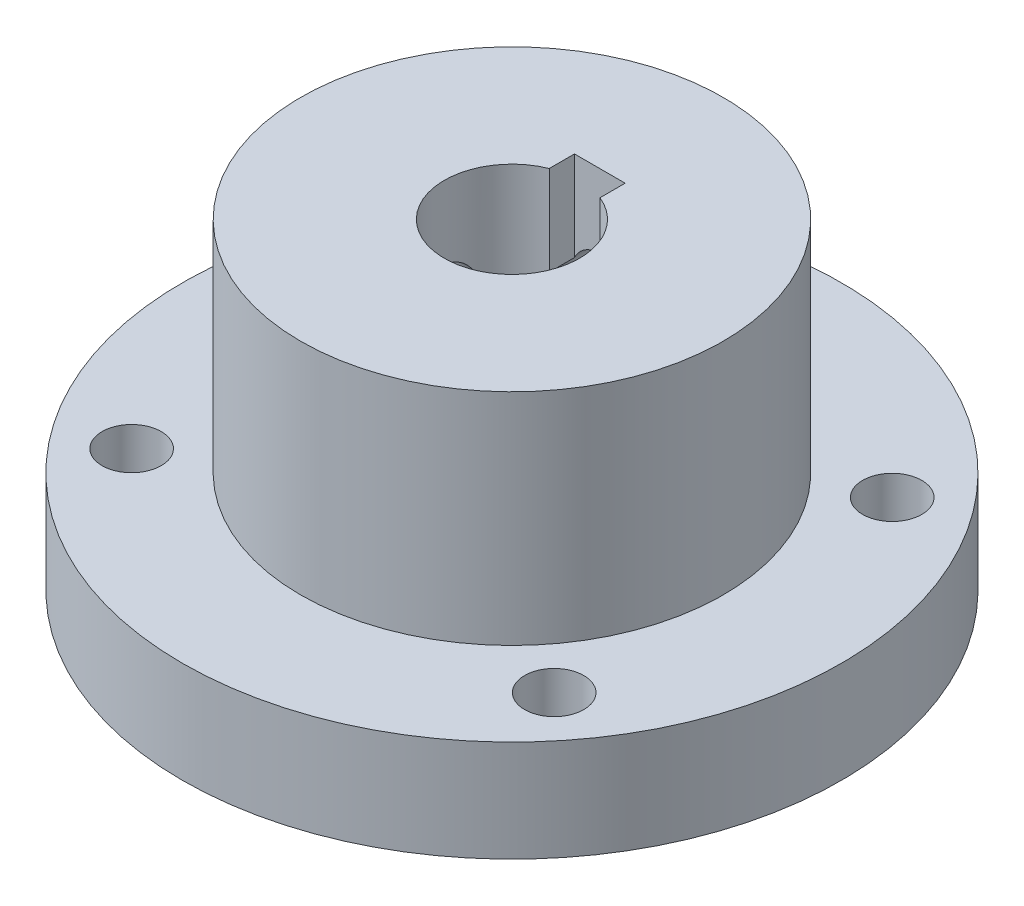
ISO-10303-21;
HEADER;
FILE_DESCRIPTION(('STEP AP214'),'2;1');
FILE_NAME('part.step','',(''),(''),'','','');
FILE_SCHEMA(('AUTOMOTIVE_DESIGN { 1 0 10303 214 1 1 1 1 }'));
ENDSEC;
DATA;
#1=APPLICATION_CONTEXT('core data for automotive mechanical design processes');
#2=APPLICATION_PROTOCOL_DEFINITION('international standard','automotive_design',2000,#1);
#3=PRODUCT_CONTEXT('',#1,'mechanical');
#4=PRODUCT('Part','Part','',(#3));
#5=PRODUCT_RELATED_PRODUCT_CATEGORY('part','',(#4));
#6=PRODUCT_DEFINITION_FORMATION('','',#4);
#7=PRODUCT_DEFINITION_CONTEXT('part definition',#1,'design');
#8=PRODUCT_DEFINITION('design','',#6,#7);
#9=PRODUCT_DEFINITION_SHAPE('','',#8);
#10=(LENGTH_UNIT() NAMED_UNIT(*) SI_UNIT(.MILLI.,.METRE.));
#11=(NAMED_UNIT(*) PLANE_ANGLE_UNIT() SI_UNIT($,.RADIAN.));
#12=(NAMED_UNIT(*) SI_UNIT($,.STERADIAN.) SOLID_ANGLE_UNIT());
#13=UNCERTAINTY_MEASURE_WITH_UNIT(LENGTH_MEASURE(1.E-05),#10,'distance_accuracy_value','');
#14=(GEOMETRIC_REPRESENTATION_CONTEXT(3) GLOBAL_UNCERTAINTY_ASSIGNED_CONTEXT((#13)) GLOBAL_UNIT_ASSIGNED_CONTEXT((#10,
#11,#12)) REPRESENTATION_CONTEXT('',''));
#15=CARTESIAN_POINT('',(0.,0.,0.));
#16=DIRECTION('',(0.,0.,1.));
#17=DIRECTION('',(1.,0.,0.));
#18=AXIS2_PLACEMENT_3D('',#15,#16,#17);
#19=CARTESIAN_POINT('',(1.5,-11.,-5.2));
#20=DIRECTION('',(1.,0.,0.));
#21=DIRECTION('',(0.,0.,-1.));
#22=AXIS2_PLACEMENT_3D('',#19,#20,#21);
#23=PLANE('',#22);
#24=DIRECTION('',(0.,-1.,0.));
#25=VECTOR('',#24,1.);
#26=CARTESIAN_POINT('',(1.5,6.,-3.70809924354783));
#27=LINE('',#26,#25);
#28=CARTESIAN_POINT('',(1.5,0.,-3.70809924354783));
#29=VERTEX_POINT('',#28);
#30=CARTESIAN_POINT('',(1.5,12.3126136457566,-3.70809924354783));
#31=VERTEX_POINT('',#30);
#32=EDGE_CURVE('E119',#29,#31,#27,.F.);
#33=ORIENTED_EDGE('',*,*,#32,.T.);
#34=DIRECTION('',(0.,0.,-1.));
#35=VECTOR('',#34,1.);
#36=CARTESIAN_POINT('',(1.5,12.3126136457566,0.499999999999997));
#37=LINE('',#36,#35);
#38=CARTESIAN_POINT('',(1.5,12.3126136457566,-5.2));
#39=VERTEX_POINT('',#38);
#40=EDGE_CURVE('E106',#31,#39,#37,.T.);
#41=ORIENTED_EDGE('',*,*,#40,.T.);
#42=DIRECTION('',(0.,1.,0.));
#43=VECTOR('',#42,1.);
#44=CARTESIAN_POINT('',(1.5,-11.,-5.2));
#45=LINE('',#44,#43);
#46=CARTESIAN_POINT('',(1.5,0.,-5.2));
#47=VERTEX_POINT('',#46);
#48=EDGE_CURVE('E116',#47,#39,#45,.T.);
#49=ORIENTED_EDGE('',*,*,#48,.F.);
#50=DIRECTION('',(0.,0.,-1.));
#51=VECTOR('',#50,1.);
#52=CARTESIAN_POINT('',(1.5,0.,0.));
#53=LINE('',#52,#51);
#54=EDGE_CURVE('E142',#29,#47,#53,.T.);
#55=ORIENTED_EDGE('',*,*,#54,.F.);
#56=EDGE_LOOP('',(#33,#41,#49,#55));
#57=FACE_BOUND('',#56,.T.);
#58=ADVANCED_FACE('F34',(#57),#23,.F.);
#59=CARTESIAN_POINT('',(-1.5,-11.,-5.2));
#60=DIRECTION('',(-1.,0.,0.));
#61=DIRECTION('',(0.,0.,1.));
#62=AXIS2_PLACEMENT_3D('',#59,#60,#61);
#63=PLANE('',#62);
#64=DIRECTION('',(0.,-1.,0.));
#65=VECTOR('',#64,1.);
#66=CARTESIAN_POINT('',(-1.5,6.,-3.70809924354783));
#67=LINE('',#66,#65);
#68=CARTESIAN_POINT('',(-1.5,19.,-3.70809924354783));
#69=VERTEX_POINT('',#68);
#70=CARTESIAN_POINT('',(-1.5,13.6873863542434,-3.70809924354783));
#71=VERTEX_POINT('',#70);
#72=EDGE_CURVE('E134',#69,#71,#67,.T.);
#73=ORIENTED_EDGE('',*,*,#72,.T.);
#74=DIRECTION('',(0.,0.,-1.));
#75=VECTOR('',#74,1.);
#76=CARTESIAN_POINT('',(-1.5,13.6873863542434,0.499999999999997));
#77=LINE('',#76,#75);
#78=CARTESIAN_POINT('',(-1.5,13.6873863542434,-5.2));
#79=VERTEX_POINT('',#78);
#80=EDGE_CURVE('E235',#71,#79,#77,.T.);
#81=ORIENTED_EDGE('',*,*,#80,.T.);
#82=DIRECTION('',(0.,1.,0.));
#83=VECTOR('',#82,1.);
#84=CARTESIAN_POINT('',(-1.5,-11.,-5.2));
#85=LINE('',#84,#83);
#86=CARTESIAN_POINT('',(-1.5,19.,-5.2));
#87=VERTEX_POINT('',#86);
#88=EDGE_CURVE('E125',#79,#87,#85,.T.);
#89=ORIENTED_EDGE('',*,*,#88,.T.);
#90=DIRECTION('',(0.,0.,1.));
#91=VECTOR('',#90,1.);
#92=CARTESIAN_POINT('',(-1.5,19.,-5.2));
#93=LINE('',#92,#91);
#94=EDGE_CURVE('E129',#87,#69,#93,.T.);
#95=ORIENTED_EDGE('',*,*,#94,.T.);
#96=EDGE_LOOP('',(#73,#81,#89,#95));
#97=FACE_BOUND('',#96,.T.);
#98=ADVANCED_FACE('F286',(#97),#63,.F.);
#99=CARTESIAN_POINT('',(-1.5,-11.,-5.2));
#100=DIRECTION('',(0.,0.,-1.));
#101=DIRECTION('',(-1.,0.,0.));
#102=AXIS2_PLACEMENT_3D('',#99,#100,#101);
#103=PLANE('',#102);
#104=ORIENTED_EDGE('',*,*,#88,.F.);
#105=CARTESIAN_POINT('',(0.,13.,-5.2));
#106=DIRECTION('',(0.,0.,-1.));
#107=DIRECTION('',(-1.,0.,0.));
#108=AXIS2_PLACEMENT_3D('',#105,#106,#107);
#109=CIRCLE('',#108,1.65);
#110=CARTESIAN_POINT('',(1.5,13.6873863542434,-5.2));
#111=VERTEX_POINT('',#110);
#112=EDGE_CURVE('E11',#79,#111,#109,.T.);
#113=ORIENTED_EDGE('',*,*,#112,.T.);
#114=CARTESIAN_POINT('',(1.5,19.,-5.2));
#115=VERTEX_POINT('',#114);
#116=EDGE_CURVE('E62',#111,#115,#45,.T.);
#117=ORIENTED_EDGE('',*,*,#116,.T.);
#118=DIRECTION('',(-1.,0.,0.));
#119=VECTOR('',#118,1.);
#120=CARTESIAN_POINT('',(-1.5,19.,-5.2));
#121=LINE('',#120,#119);
#122=EDGE_CURVE('E195',#115,#87,#121,.T.);
#123=ORIENTED_EDGE('',*,*,#122,.T.);
#124=EDGE_LOOP('',(#104,#113,#117,#123));
#125=FACE_BOUND('',#124,.T.);
#126=ADVANCED_FACE('F291',(#125),#103,.F.);
#127=CARTESIAN_POINT('',(0.,6.,0.));
#128=DIRECTION('',(0.,1.,0.));
#129=DIRECTION('',(0.,0.,1.));
#130=AXIS2_PLACEMENT_3D('',#127,#128,#129);
#131=PLANE('',#130);
#132=CARTESIAN_POINT('',(0.,6.,0.));
#133=DIRECTION('',(0.,1.,0.));
#134=DIRECTION('',(0.,0.,1.));
#135=AXIS2_PLACEMENT_3D('',#132,#133,#134);
#136=CIRCLE('',#135,12.5);
#137=CARTESIAN_POINT('',(0.,6.,12.5));
#138=VERTEX_POINT('',#137);
#139=EDGE_CURVE('E151',#138,#138,#136,.T.);
#140=ORIENTED_EDGE('',*,*,#139,.F.);
#141=EDGE_LOOP('',(#140));
#142=FACE_BOUND('',#141,.T.);
#143=CARTESIAN_POINT('',(12.5,6.,10.));
#144=DIRECTION('',(0.,1.,0.));
#145=DIRECTION('',(0.,0.,1.));
#146=AXIS2_PLACEMENT_3D('',#143,#144,#145);
#147=CIRCLE('',#146,1.75);
#148=CARTESIAN_POINT('',(12.5,6.,11.75));
#149=VERTEX_POINT('',#148);
#150=EDGE_CURVE('E161',#149,#149,#147,.T.);
#151=ORIENTED_EDGE('',*,*,#150,.F.);
#152=EDGE_LOOP('',(#151));
#153=FACE_BOUND('',#152,.T.);
#154=CARTESIAN_POINT('',(-12.5,6.,-10.));
#155=DIRECTION('',(0.,1.,0.));
#156=DIRECTION('',(0.,0.,1.));
#157=AXIS2_PLACEMENT_3D('',#154,#155,#156);
#158=CIRCLE('',#157,1.75);
#159=CARTESIAN_POINT('',(-12.5,6.,-8.25));
#160=VERTEX_POINT('',#159);
#161=EDGE_CURVE('E173',#160,#160,#158,.T.);
#162=ORIENTED_EDGE('',*,*,#161,.F.);
#163=EDGE_LOOP('',(#162));
#164=FACE_BOUND('',#163,.T.);
#165=CARTESIAN_POINT('',(0.,6.,0.));
#166=DIRECTION('',(0.,1.,0.));
#167=DIRECTION('',(0.,0.,1.));
#168=AXIS2_PLACEMENT_3D('',#165,#166,#167);
#169=CIRCLE('',#168,19.5);
#170=CARTESIAN_POINT('',(0.,6.,19.5));
#171=VERTEX_POINT('',#170);
#172=EDGE_CURVE('E154',#171,#171,#169,.T.);
#173=ORIENTED_EDGE('',*,*,#172,.T.);
#174=EDGE_LOOP('',(#173));
#175=FACE_BOUND('',#174,.T.);
#176=CARTESIAN_POINT('',(-12.5,6.,10.));
#177=DIRECTION('',(0.,1.,0.));
#178=DIRECTION('',(0.,0.,1.));
#179=AXIS2_PLACEMENT_3D('',#176,#177,#178);
#180=CIRCLE('',#179,1.75);
#181=CARTESIAN_POINT('',(-12.5,6.,11.75));
#182=VERTEX_POINT('',#181);
#183=EDGE_CURVE('E167',#182,#182,#180,.T.);
#184=ORIENTED_EDGE('',*,*,#183,.F.);
#185=EDGE_LOOP('',(#184));
#186=FACE_BOUND('',#185,.T.);
#187=CARTESIAN_POINT('',(12.5,6.,-10.));
#188=DIRECTION('',(0.,1.,0.));
#189=DIRECTION('',(0.,0.,1.));
#190=AXIS2_PLACEMENT_3D('',#187,#188,#189);
#191=CIRCLE('',#190,1.75);
#192=CARTESIAN_POINT('',(12.5,6.,-8.25));
#193=VERTEX_POINT('',#192);
#194=EDGE_CURVE('E155',#193,#193,#191,.T.);
#195=ORIENTED_EDGE('',*,*,#194,.F.);
#196=EDGE_LOOP('',(#195));
#197=FACE_BOUND('',#196,.T.);
#198=ADVANCED_FACE('F244',(#142,#153,#164,#175,#186,#197),#131,.T.);
#199=CARTESIAN_POINT('',(0.,0.,0.));
#200=DIRECTION('',(0.,1.,0.));
#201=DIRECTION('',(0.,0.,1.));
#202=AXIS2_PLACEMENT_3D('',#199,#200,#201);
#203=PLANE('',#202);
#204=CARTESIAN_POINT('',(0.,0.,0.));
#205=DIRECTION('',(0.,1.,0.));
#206=DIRECTION('',(0.,0.,1.));
#207=AXIS2_PLACEMENT_3D('',#204,#205,#206);
#208=CIRCLE('',#207,4.);
#209=CARTESIAN_POINT('',(-1.5,0.,-3.70809924354783));
#210=VERTEX_POINT('',#209);
#211=EDGE_CURVE('E176',#210,#29,#208,.T.);
#212=ORIENTED_EDGE('',*,*,#211,.T.);
#213=ORIENTED_EDGE('',*,*,#54,.T.);
#214=DIRECTION('',(-1.,0.,0.));
#215=VECTOR('',#214,1.);
#216=CARTESIAN_POINT('',(0.,0.,-5.2));
#217=LINE('',#216,#215);
#218=CARTESIAN_POINT('',(-1.5,0.,-5.2));
#219=VERTEX_POINT('',#218);
#220=EDGE_CURVE('E124',#47,#219,#217,.T.);
#221=ORIENTED_EDGE('',*,*,#220,.T.);
#222=DIRECTION('',(0.,0.,1.));
#223=VECTOR('',#222,1.);
#224=CARTESIAN_POINT('',(-1.5,0.,0.));
#225=LINE('',#224,#223);
#226=EDGE_CURVE('E137',#219,#210,#225,.T.);
#227=ORIENTED_EDGE('',*,*,#226,.T.);
#228=EDGE_LOOP('',(#212,#213,#221,#227));
#229=FACE_BOUND('',#228,.T.);
#230=CARTESIAN_POINT('',(0.,0.,0.));
#231=DIRECTION('',(0.,1.,0.));
#232=DIRECTION('',(0.,0.,1.));
#233=AXIS2_PLACEMENT_3D('',#230,#231,#232);
#234=CIRCLE('',#233,19.5);
#235=CARTESIAN_POINT('',(0.,0.,19.5));
#236=VERTEX_POINT('',#235);
#237=EDGE_CURVE('E181',#236,#236,#234,.T.);
#238=ORIENTED_EDGE('',*,*,#237,.F.);
#239=EDGE_LOOP('',(#238));
#240=FACE_BOUND('',#239,.T.);
#241=CARTESIAN_POINT('',(-12.5,0.,-10.));
#242=DIRECTION('',(0.,1.,0.));
#243=DIRECTION('',(0.,0.,1.));
#244=AXIS2_PLACEMENT_3D('',#241,#242,#243);
#245=CIRCLE('',#244,1.75);
#246=CARTESIAN_POINT('',(-12.5,0.,-8.25));
#247=VERTEX_POINT('',#246);
#248=EDGE_CURVE('E170',#247,#247,#245,.T.);
#249=ORIENTED_EDGE('',*,*,#248,.T.);
#250=EDGE_LOOP('',(#249));
#251=FACE_BOUND('',#250,.T.);
#252=CARTESIAN_POINT('',(-12.5,0.,10.));
#253=DIRECTION('',(0.,1.,0.));
#254=DIRECTION('',(0.,0.,1.));
#255=AXIS2_PLACEMENT_3D('',#252,#253,#254);
#256=CIRCLE('',#255,1.75);
#257=CARTESIAN_POINT('',(-12.5,0.,11.75));
#258=VERTEX_POINT('',#257);
#259=EDGE_CURVE('E164',#258,#258,#256,.T.);
#260=ORIENTED_EDGE('',*,*,#259,.T.);
#261=EDGE_LOOP('',(#260));
#262=FACE_BOUND('',#261,.T.);
#263=CARTESIAN_POINT('',(12.5,0.,10.));
#264=DIRECTION('',(0.,1.,0.));
#265=DIRECTION('',(0.,0.,1.));
#266=AXIS2_PLACEMENT_3D('',#263,#264,#265);
#267=CIRCLE('',#266,1.75);
#268=CARTESIAN_POINT('',(12.5,0.,11.75));
#269=VERTEX_POINT('',#268);
#270=EDGE_CURVE('E158',#269,#269,#267,.T.);
#271=ORIENTED_EDGE('',*,*,#270,.T.);
#272=EDGE_LOOP('',(#271));
#273=FACE_BOUND('',#272,.T.);
#274=CARTESIAN_POINT('',(12.5,0.,-10.));
#275=DIRECTION('',(0.,1.,0.));
#276=DIRECTION('',(0.,0.,1.));
#277=AXIS2_PLACEMENT_3D('',#274,#275,#276);
#278=CIRCLE('',#277,1.75);
#279=CARTESIAN_POINT('',(12.5,0.,-8.25));
#280=VERTEX_POINT('',#279);
#281=EDGE_CURVE('E150',#280,#280,#278,.T.);
#282=ORIENTED_EDGE('',*,*,#281,.T.);
#283=EDGE_LOOP('',(#282));
#284=FACE_BOUND('',#283,.T.);
#285=ADVANCED_FACE('F261',(#229,#240,#251,#262,#273,#284),#203,.F.);
#286=CARTESIAN_POINT('',(0.,6.,0.));
#287=DIRECTION('',(0.,-1.,0.));
#288=DIRECTION('',(0.,0.,-1.));
#289=AXIS2_PLACEMENT_3D('',#286,#287,#288);
#290=CYLINDRICAL_SURFACE('',#289,19.5);
#291=ORIENTED_EDGE('',*,*,#237,.T.);
#292=EDGE_LOOP('',(#291));
#293=FACE_BOUND('',#292,.T.);
#294=ORIENTED_EDGE('',*,*,#172,.F.);
#295=EDGE_LOOP('',(#294));
#296=FACE_BOUND('',#295,.T.);
#297=ADVANCED_FACE('F36',(#293,#296),#290,.T.);
#298=CARTESIAN_POINT('',(0.,6.,0.));
#299=DIRECTION('',(0.,-1.,0.));
#300=DIRECTION('',(0.,0.,-1.));
#301=AXIS2_PLACEMENT_3D('',#298,#299,#300);
#302=CYLINDRICAL_SURFACE('',#301,4.);
#303=CARTESIAN_POINT('',(-3.64383040220041,13.,-1.65));
#304=CARTESIAN_POINT('',(-3.64383945275153,13.0880964802257,-1.64999056813102));
#305=CARTESIAN_POINT('',(-3.64707173267573,13.1763404319736,-1.64289989177358));
#306=CARTESIAN_POINT('',(-3.65959209124688,13.3502870610789,-1.61480845546373));
#307=CARTESIAN_POINT('',(-3.66889676295874,13.4359821005976,-1.5937695789634));
#308=CARTESIAN_POINT('',(-3.69231325052125,13.6020029381306,-1.53873536249638));
#309=CARTESIAN_POINT('',(-3.70640571161012,13.6823488202186,-1.50479212400174));
#310=CARTESIAN_POINT('',(-3.73778230052357,13.8361817668342,-1.42506535594207));
#311=CARTESIAN_POINT('',(-3.75506562873473,13.909670542784,-1.37928479159595));
#312=CARTESIAN_POINT('',(-3.7920553041855,14.0522286878465,-1.27419856290372));
#313=CARTESIAN_POINT('',(-3.81184277704779,14.1208292557802,-1.2142851824136));
#314=CARTESIAN_POINT('',(-3.85094363418238,14.2473547719088,-1.08391072165483));
#315=CARTESIAN_POINT('',(-3.87025683535296,14.3052756514722,-1.01344563996365));
#316=CARTESIAN_POINT('',(-3.90721575035942,14.4111713713019,-0.860301943593384));
#317=CARTESIAN_POINT('',(-3.92475616703248,14.4586209327062,-0.777232390113593));
#318=CARTESIAN_POINT('',(-3.95520283117798,14.5386701453217,-0.603436361875859));
#319=CARTESIAN_POINT('',(-3.96811109652272,14.5712762643466,-0.512713242513046));
#320=CARTESIAN_POINT('',(-3.98726403378776,14.6190207066562,-0.3311051723044));
#321=CARTESIAN_POINT('',(-3.99381564337609,14.6349668479232,-0.240465625184493));
#322=CARTESIAN_POINT('',(-4.0006306156112,14.6515466518552,-0.057576355149866));
#323=CARTESIAN_POINT('',(-4.00089647540932,14.652186395322,0.0346727137709544));
#324=CARTESIAN_POINT('',(-3.99529224160632,14.6385635038634,0.212297380895984));
#325=CARTESIAN_POINT('',(-3.98978733384658,14.6251878162829,0.297754665400396));
#326=CARTESIAN_POINT('',(-3.97375926025944,14.5854311825522,0.465085845235279));
#327=CARTESIAN_POINT('',(-3.96323572489496,14.5590492787093,0.546959476205492));
#328=CARTESIAN_POINT('',(-3.93798907731603,14.4937123382798,0.706295606817229));
#329=CARTESIAN_POINT('',(-3.92320447216362,14.4545720100751,0.783671979762469));
#330=CARTESIAN_POINT('',(-3.89088763760773,14.3650087208134,0.930960489992465));
#331=CARTESIAN_POINT('',(-3.87335444442336,14.3145817994967,1.00086999453932));
#332=CARTESIAN_POINT('',(-3.83587133640027,14.1998117609714,1.13638530947041));
#333=CARTESIAN_POINT('',(-3.8158381454309,14.1347465891013,1.20135746318645));
#334=CARTESIAN_POINT('',(-3.77653142784555,13.9945903336784,1.31973838423493));
#335=CARTESIAN_POINT('',(-3.75725818494773,13.9194955507367,1.37314286572202));
#336=CARTESIAN_POINT('',(-3.72106607156909,13.7584015964527,1.46845339844828));
#337=CARTESIAN_POINT('',(-3.70424107982558,13.6721324283074,1.50994179309277));
#338=CARTESIAN_POINT('',(-3.67596385006485,13.4929533285941,1.57754508127096));
#339=CARTESIAN_POINT('',(-3.66450786071417,13.4000480861262,1.60367071206121));
#340=CARTESIAN_POINT('',(-3.64919091711418,13.216577104815,1.63821320355942));
#341=CARTESIAN_POINT('',(-3.64489111171831,13.1262416988171,1.64765569454682));
#342=CARTESIAN_POINT('',(-3.64311980380967,12.9451943703014,1.65157101672826));
#343=CARTESIAN_POINT('',(-3.64564601607449,12.8544825839407,1.64604885780402));
#344=CARTESIAN_POINT('',(-3.65678944366161,12.6811989909505,1.62112710501826));
#345=CARTESIAN_POINT('',(-3.66501803861664,12.5984718203254,1.60261202118543));
#346=CARTESIAN_POINT('',(-3.68614612916707,12.43736293562,1.55339580262015));
#347=CARTESIAN_POINT('',(-3.69904670212356,12.3589822286483,1.52269185697123));
#348=CARTESIAN_POINT('',(-3.72872477858182,12.2051209943044,1.44853902204985));
#349=CARTESIAN_POINT('',(-3.74564214050945,12.1298998052208,1.40460979308264));
#350=CARTESIAN_POINT('',(-3.78124523189864,11.9875398305703,1.30573455409451));
#351=CARTESIAN_POINT('',(-3.79993171387674,11.9204045122649,1.25078384473683));
#352=CARTESIAN_POINT('',(-3.83876011670653,11.7905703735533,1.12627542162099));
#353=CARTESIAN_POINT('',(-3.85889967217623,11.7286482629513,1.05590387126704));
#354=CARTESIAN_POINT('',(-3.89698114804694,11.6173571443379,0.905297980080105));
#355=CARTESIAN_POINT('',(-3.91492292631236,11.5679889479968,0.825063002026905));
#356=CARTESIAN_POINT('',(-3.94668767391886,11.4832958657932,0.656516816883268));
#357=CARTESIAN_POINT('',(-3.96050313975064,11.4479965249973,0.568191273870492));
#358=CARTESIAN_POINT('',(-3.98237104121021,11.3930083431413,0.386140833605178));
#359=CARTESIAN_POINT('',(-3.9904268305481,11.3733104170611,0.292419112817562));
#360=CARTESIAN_POINT('',(-3.9994889299446,11.3512117710795,0.109187189544837));
#361=CARTESIAN_POINT('',(-4.00094173424749,11.3477151712581,0.0198303081186369));
#362=CARTESIAN_POINT('',(-3.99786220239438,11.3551854343703,-0.15816173919541));
#363=CARTESIAN_POINT('',(-3.99333087896147,11.3661498499955,-0.246797024648478));
#364=CARTESIAN_POINT('',(-3.979024148364,11.4014446421356,-0.417705375935875));
#365=CARTESIAN_POINT('',(-3.96943363922013,11.4253044421146,-0.500092371627851));
#366=CARTESIAN_POINT('',(-3.94605480923816,11.48520411488,-0.659667355734159));
#367=CARTESIAN_POINT('',(-3.93226568297163,11.5212463247867,-0.736854343148743));
#368=CARTESIAN_POINT('',(-3.90105808483759,11.6063045266864,-0.887661133732618));
#369=CARTESIAN_POINT('',(-3.88350423911689,11.6558312567729,-0.960964214361149));
#370=CARTESIAN_POINT('',(-3.84685709666619,11.76570284679,-1.09852932170705));
#371=CARTESIAN_POINT('',(-3.82776324400832,11.8260516230808,-1.1627880603165));
#372=CARTESIAN_POINT('',(-3.78859741195738,11.9605875273547,-1.28487769945047));
#373=CARTESIAN_POINT('',(-3.76854475207571,12.0354277568849,-1.34199767947157));
#374=CARTESIAN_POINT('',(-3.73105419200534,12.1942659756811,-1.4429647467733));
#375=CARTESIAN_POINT('',(-3.7136177396712,12.2782689917096,-1.48680449811903));
#376=CARTESIAN_POINT('',(-3.68370387904713,12.4527284412699,-1.55944447766651));
#377=CARTESIAN_POINT('',(-3.67119480418034,12.5431391080911,-1.58834112875234));
#378=CARTESIAN_POINT('',(-3.65281837075147,12.7280471440784,-1.63017263567573));
#379=CARTESIAN_POINT('',(-3.64692873900432,12.8225296908769,-1.64316103312974));
#380=CARTESIAN_POINT('',(-3.64414054419779,12.9448633136426,-1.6493120932942));
#381=CARTESIAN_POINT('',(-3.64382756923722,12.972424432285,-1.6500029523216));
#382=CARTESIAN_POINT('',(-3.64383040220041,13.,-1.65));
#383=B_SPLINE_CURVE_WITH_KNOTS('',3,(#303,#304,#305,#306,#307,#308,#309,#310,#311,#312,#313,
#314,#315,#316,#317,#318,#319,#320,#321,#322,#323,#324,#325,#326,#327,#328,#329,#330,#331,#332,
#333,#334,#335,#336,#337,#338,#339,#340,#341,#342,#343,#344,#345,#346,#347,#348,#349,#350,#351,
#352,#353,#354,#355,#356,#357,#358,#359,#360,#361,#362,#363,#364,#365,#366,#367,#368,#369,#370,
#371,#372,#373,#374,#375,#376,#377,#378,#379,#380,#381,#382),.UNSPECIFIED.,.T.,.F.,(4,2,2,2,2,2,
2,2,2,2,2,2,2,2,2,2,2,2,2,2,2,2,2,2,2,2,2,2,2,2,2,2,2,2,2,2,2,2,2,4),(0.,0.264211724660745,
0.529148459018597,0.793026677872051,1.05683885985756,1.33523297260792,1.61373292676209,
1.90403076094908,2.19420198072699,2.4695381624427,2.74476495901024,3.00356896819766,
3.26239203686791,3.5251552692474,3.78801084539546,4.06907613148065,4.35024537535725,
4.64031806272423,4.9301877724111,5.20152035698263,5.47276211576042,5.72713321026166,
5.98156300028881,6.24665916965709,6.51186861189124,6.79815687284347,7.08446363898863,
7.37128791456171,7.65794504349151,7.92489841526079,8.19180661499935,8.44957452423759,
8.70739191275388,8.97680852354695,9.24632283025307,9.53374725602175,9.82133016535516,
10.1070334851925,10.3917725616094,10.4744749384332),.UNSPECIFIED.);
#384=CARTESIAN_POINT('',(-3.64383040220041,13.,-1.65));
#385=VERTEX_POINT('',#384);
#386=EDGE_CURVE('E248',#385,#385,#383,.T.);
#387=ORIENTED_EDGE('',*,*,#386,.F.);
#388=EDGE_LOOP('',(#387));
#389=FACE_BOUND('',#388,.T.);
#390=CARTESIAN_POINT('',(-1.5,13.6873863542434,-3.70809924354783));
#391=CARTESIAN_POINT('',(-1.51784229567098,13.6484484236741,-3.70087991977864));
#392=CARTESIAN_POINT('',(-1.53419507984804,13.6087599574599,-3.69411717855116));
#393=CARTESIAN_POINT('',(-1.56380852026865,13.5280661929302,-3.68167930070359));
#394=CARTESIAN_POINT('',(-1.57706813827598,13.4870604577063,-3.6760045293794));
#395=CARTESIAN_POINT('',(-1.61196910729927,13.3625688863113,-3.66090333384308));
#396=CARTESIAN_POINT('',(-1.62881303837392,13.2774335476214,-3.65336632323873));
#397=CARTESIAN_POINT('',(-1.64894634707749,13.1050498038304,-3.64432464268792));
#398=CARTESIAN_POINT('',(-1.65219837615274,13.0177962381245,-3.64283659471029));
#399=CARTESIAN_POINT('',(-1.64490665646569,12.8440067479827,-3.64613441674973));
#400=CARTESIAN_POINT('',(-1.63437019265692,12.7574704688805,-3.65091697378464));
#401=CARTESIAN_POINT('',(-1.60457583426967,12.6102705752879,-3.66408526364648));
#402=CARTESIAN_POINT('',(-1.58837958503949,12.5488424871727,-3.67117577616051));
#403=CARTESIAN_POINT('',(-1.54919295874361,12.4285928341724,-3.68787569607198));
#404=CARTESIAN_POINT('',(-1.52620734036164,12.3697694767221,-3.69748333867616));
#405=CARTESIAN_POINT('',(-1.5,12.3126136457566,-3.70809924354783));
#406=B_SPLINE_CURVE_WITH_KNOTS('',3,(#390,#391,#392,#393,#394,#395,#396,#397,#398,#399,#400,
#401,#402,#403,#404,#405),.UNSPECIFIED.,.F.,.F.,(4,2,2,2,2,2,2,4),(0.,0.130238259631636,
0.260520171667667,0.520504127411389,0.781202013156259,1.04176221848433,1.23308204646286,
1.42426809487496),.UNSPECIFIED.);
#407=CARTESIAN_POINT('',(-1.5,12.3126136457566,-3.70809924354783));
#408=VERTEX_POINT('',#407);
#409=EDGE_CURVE('E230',#71,#408,#406,.T.);
#410=ORIENTED_EDGE('',*,*,#409,.F.);
#411=ORIENTED_EDGE('',*,*,#72,.F.);
#412=CARTESIAN_POINT('',(0.,19.,0.));
#413=DIRECTION('',(0.,1.,0.));
#414=DIRECTION('',(0.,0.,1.));
#415=AXIS2_PLACEMENT_3D('',#412,#413,#414);
#416=CIRCLE('',#415,4.);
#417=CARTESIAN_POINT('',(1.5,19.,-3.70809924354783));
#418=VERTEX_POINT('',#417);
#419=EDGE_CURVE('E144',#69,#418,#416,.T.);
#420=ORIENTED_EDGE('',*,*,#419,.T.);
#421=CARTESIAN_POINT('',(1.5,13.6873863542434,-3.70809924354783));
#422=VERTEX_POINT('',#421);
#423=EDGE_CURVE('E140',#422,#418,#27,.F.);
#424=ORIENTED_EDGE('',*,*,#423,.F.);
#425=CARTESIAN_POINT('',(1.5,12.3126136457566,-3.70809924354783));
#426=CARTESIAN_POINT('',(1.51784229567098,12.3515515763259,-3.70087991977864));
#427=CARTESIAN_POINT('',(1.53419507984804,12.3912400425401,-3.69411717855116));
#428=CARTESIAN_POINT('',(1.56380852026865,12.4719338070698,-3.68167930070359));
#429=CARTESIAN_POINT('',(1.57706813827598,12.5129395422937,-3.6760045293794));
#430=CARTESIAN_POINT('',(1.61196910729927,12.6374311136887,-3.66090333384308));
#431=CARTESIAN_POINT('',(1.62881303837392,12.7225664523787,-3.65336632323873));
#432=CARTESIAN_POINT('',(1.64894634707749,12.8949501961696,-3.64432464268792));
#433=CARTESIAN_POINT('',(1.65219837615274,12.9822037618756,-3.64283659471029));
#434=CARTESIAN_POINT('',(1.64490665646569,13.1559932520173,-3.64613441674973));
#435=CARTESIAN_POINT('',(1.63437019265692,13.2425295311195,-3.65091697378464));
#436=CARTESIAN_POINT('',(1.60457583426967,13.3897294247121,-3.66408526364648));
#437=CARTESIAN_POINT('',(1.58837958503948,13.4511575128273,-3.67117577616051));
#438=CARTESIAN_POINT('',(1.54919295874361,13.5714071658276,-3.68787569607198));
#439=CARTESIAN_POINT('',(1.52620734036164,13.6302305232779,-3.69748333867616));
#440=CARTESIAN_POINT('',(1.5,13.6873863542434,-3.70809924354783));
#441=B_SPLINE_CURVE_WITH_KNOTS('',3,(#425,#426,#427,#428,#429,#430,#431,#432,#433,#434,#435,
#436,#437,#438,#439,#440),.UNSPECIFIED.,.F.,.F.,(4,2,2,2,2,2,2,4),(0.,0.130238259631636,
0.260520171667667,0.520504127411389,0.781202013156259,1.04176221848433,1.23308204646285,
1.42426809487495),.UNSPECIFIED.);
#442=EDGE_CURVE('E120',#31,#422,#441,.T.);
#443=ORIENTED_EDGE('',*,*,#442,.F.);
#444=ORIENTED_EDGE('',*,*,#32,.F.);
#445=ORIENTED_EDGE('',*,*,#211,.F.);
#446=EDGE_CURVE('E133',#408,#210,#67,.T.);
#447=ORIENTED_EDGE('',*,*,#446,.F.);
#448=EDGE_LOOP('',(#410,#411,#420,#424,#443,#444,#445,#447));
#449=FACE_BOUND('',#448,.T.);
#450=ADVANCED_FACE('F236',(#389,#449),#302,.F.);
#451=CARTESIAN_POINT('',(-12.5,6.,-10.));
#452=DIRECTION('',(0.,-1.,0.));
#453=DIRECTION('',(0.,0.,-1.));
#454=AXIS2_PLACEMENT_3D('',#451,#452,#453);
#455=CYLINDRICAL_SURFACE('',#454,1.75);
#456=ORIENTED_EDGE('',*,*,#161,.T.);
#457=EDGE_LOOP('',(#456));
#458=FACE_BOUND('',#457,.T.);
#459=ORIENTED_EDGE('',*,*,#248,.F.);
#460=EDGE_LOOP('',(#459));
#461=FACE_BOUND('',#460,.T.);
#462=ADVANCED_FACE('F241',(#458,#461),#455,.F.);
#463=CARTESIAN_POINT('',(-12.5,6.,10.));
#464=DIRECTION('',(0.,-1.,0.));
#465=DIRECTION('',(0.,0.,-1.));
#466=AXIS2_PLACEMENT_3D('',#463,#464,#465);
#467=CYLINDRICAL_SURFACE('',#466,1.75);
#468=ORIENTED_EDGE('',*,*,#183,.T.);
#469=EDGE_LOOP('',(#468));
#470=FACE_BOUND('',#469,.T.);
#471=ORIENTED_EDGE('',*,*,#259,.F.);
#472=EDGE_LOOP('',(#471));
#473=FACE_BOUND('',#472,.T.);
#474=ADVANCED_FACE('F282',(#470,#473),#467,.F.);
#475=CARTESIAN_POINT('',(12.5,6.,10.));
#476=DIRECTION('',(0.,-1.,0.));
#477=DIRECTION('',(0.,0.,-1.));
#478=AXIS2_PLACEMENT_3D('',#475,#476,#477);
#479=CYLINDRICAL_SURFACE('',#478,1.75);
#480=ORIENTED_EDGE('',*,*,#150,.T.);
#481=EDGE_LOOP('',(#480));
#482=FACE_BOUND('',#481,.T.);
#483=ORIENTED_EDGE('',*,*,#270,.F.);
#484=EDGE_LOOP('',(#483));
#485=FACE_BOUND('',#484,.T.);
#486=ADVANCED_FACE('F276',(#482,#485),#479,.F.);
#487=CARTESIAN_POINT('',(12.5,6.,-10.));
#488=DIRECTION('',(0.,-1.,0.));
#489=DIRECTION('',(0.,0.,-1.));
#490=AXIS2_PLACEMENT_3D('',#487,#488,#489);
#491=CYLINDRICAL_SURFACE('',#490,1.75);
#492=ORIENTED_EDGE('',*,*,#194,.T.);
#493=EDGE_LOOP('',(#492));
#494=FACE_BOUND('',#493,.T.);
#495=ORIENTED_EDGE('',*,*,#281,.F.);
#496=EDGE_LOOP('',(#495));
#497=FACE_BOUND('',#496,.T.);
#498=ADVANCED_FACE('F274',(#494,#497),#491,.F.);
#499=CARTESIAN_POINT('',(0.,19.,0.));
#500=DIRECTION('',(0.,1.,0.));
#501=DIRECTION('',(0.,0.,1.));
#502=AXIS2_PLACEMENT_3D('',#499,#500,#501);
#503=PLANE('',#502);
#504=DIRECTION('',(0.,0.,-1.));
#505=VECTOR('',#504,1.);
#506=CARTESIAN_POINT('',(1.5,19.,0.));
#507=LINE('',#506,#505);
#508=EDGE_CURVE('E112',#418,#115,#507,.T.);
#509=ORIENTED_EDGE('',*,*,#508,.F.);
#510=ORIENTED_EDGE('',*,*,#419,.F.);
#511=ORIENTED_EDGE('',*,*,#94,.F.);
#512=ORIENTED_EDGE('',*,*,#122,.F.);
#513=EDGE_LOOP('',(#509,#510,#511,#512));
#514=FACE_BOUND('',#513,.T.);
#515=CARTESIAN_POINT('',(0.,19.,0.));
#516=DIRECTION('',(0.,1.,0.));
#517=DIRECTION('',(0.,0.,1.));
#518=AXIS2_PLACEMENT_3D('',#515,#516,#517);
#519=CIRCLE('',#518,12.5);
#520=CARTESIAN_POINT('',(0.,19.,12.5));
#521=VERTEX_POINT('',#520);
#522=EDGE_CURVE('E147',#521,#521,#519,.T.);
#523=ORIENTED_EDGE('',*,*,#522,.T.);
#524=EDGE_LOOP('',(#523));
#525=FACE_BOUND('',#524,.T.);
#526=ADVANCED_FACE('F196',(#514,#525),#503,.T.);
#527=CARTESIAN_POINT('',(0.,19.,0.));
#528=DIRECTION('',(0.,-1.,0.));
#529=DIRECTION('',(0.,0.,-1.));
#530=AXIS2_PLACEMENT_3D('',#527,#528,#529);
#531=CYLINDRICAL_SURFACE('',#530,12.5);
#532=CARTESIAN_POINT('',(-12.3906214533412,13.,-1.65));
#533=CARTESIAN_POINT('',(-12.390622842409,13.0922470187503,-1.64999610504496));
#534=CARTESIAN_POINT('',(-12.3916627387899,13.1845506197203,-1.64223796098613));
#535=CARTESIAN_POINT('',(-12.3957080675848,13.3665858913211,-1.61141361420501));
#536=CARTESIAN_POINT('',(-12.3987155180302,13.456314822489,-1.58833169421808));
#537=CARTESIAN_POINT('',(-12.4063495138996,13.630539003208,-1.52755482004115));
#538=CARTESIAN_POINT('',(-12.4109749226447,13.7150378781549,-1.48987012287356));
#539=CARTESIAN_POINT('',(-12.4213223048405,13.8764977292384,-1.40097999603679));
#540=CARTESIAN_POINT('',(-12.427044100401,13.9534599251555,-1.34977675926166));
#541=CARTESIAN_POINT('',(-12.4389794327506,14.0981556850169,-1.23496184347489));
#542=CARTESIAN_POINT('',(-12.4451955281557,14.165835525231,-1.17128271724033));
#543=CARTESIAN_POINT('',(-12.4573961026217,14.2895809209193,-1.03346898669931));
#544=CARTESIAN_POINT('',(-12.4633805698383,14.3456458831015,-0.959333848621129));
#545=CARTESIAN_POINT('',(-12.4744699620017,14.4447643459892,-0.802372955937549));
#546=CARTESIAN_POINT('',(-12.4795715536533,14.4877689794661,-0.719516086861359));
#547=CARTESIAN_POINT('',(-12.4882921996643,14.5592328915234,-0.547677504608517));
#548=CARTESIAN_POINT('',(-12.4919113151218,14.5876927695571,-0.458696044024823));
#549=CARTESIAN_POINT('',(-12.4972412029392,14.6290981063544,-0.277684805755406));
#550=CARTESIAN_POINT('',(-12.4989629831594,14.6421330894115,-0.185675835591701));
#551=CARTESIAN_POINT('',(-12.5003418301835,14.6525962090655,-0.000761418784681387));
#552=CARTESIAN_POINT('',(-12.4999989870218,14.6500250262189,0.0921439885902288));
#553=CARTESIAN_POINT('',(-12.4972960932803,14.6294202580362,0.275604499217212));
#554=CARTESIAN_POINT('',(-12.4949486047565,14.611482961824,0.366170628040519));
#555=CARTESIAN_POINT('',(-12.4885142485345,14.5608058239852,0.542995946055187));
#556=CARTESIAN_POINT('',(-12.4844273445935,14.528065673923,0.629255045462714));
#557=CARTESIAN_POINT('',(-12.4749517127752,14.4486108115472,0.795314074664808));
#558=CARTESIAN_POINT('',(-12.4695591400754,14.4018547276572,0.875093980945276));
#559=CARTESIAN_POINT('',(-12.4580748892249,14.2957253535836,1.0257115602364));
#560=CARTESIAN_POINT('',(-12.4519831753473,14.2363514184822,1.09654877587727));
#561=CARTESIAN_POINT('',(-12.4397269723775,14.1061331957069,1.22783637230535));
#562=CARTESIAN_POINT('',(-12.4335622824552,14.0352049485835,1.28820348917064));
#563=CARTESIAN_POINT('',(-12.4219005988811,13.8841790771766,1.39618935869221));
#564=CARTESIAN_POINT('',(-12.4164036077809,13.8040814178526,1.44380806262865));
#565=CARTESIAN_POINT('',(-12.4066998381533,13.6369129194324,1.52495183360794));
#566=CARTESIAN_POINT('',(-12.4024937156614,13.5498385629449,1.55846973764615));
#567=CARTESIAN_POINT('',(-12.3958603785865,13.3712291700609,1.61038403482922));
#568=CARTESIAN_POINT('',(-12.3934330680179,13.2796943746362,1.62878124390082));
#569=CARTESIAN_POINT('',(-12.3906499237645,13.0954992426081,1.64982062797812));
#570=CARTESIAN_POINT('',(-12.3902786546195,13.0028525405258,1.65258020410815));
#571=CARTESIAN_POINT('',(-12.3916087674049,12.8184181125204,1.64257621411444));
#572=CARTESIAN_POINT('',(-12.3933100999289,12.7266303661741,1.62981301802077));
#573=CARTESIAN_POINT('',(-12.3985796103553,12.5468742950692,1.58922482572925));
#574=CARTESIAN_POINT('',(-12.4021406872895,12.4588928111799,1.56145710665122));
#575=CARTESIAN_POINT('',(-12.4107226630909,12.2888342016108,1.49170721345535));
#576=CARTESIAN_POINT('',(-12.4157436187973,12.2067573059761,1.44972448587794));
#577=CARTESIAN_POINT('',(-12.4267164355394,12.0503078512077,1.35244938903313));
#578=CARTESIAN_POINT('',(-12.4326735912836,11.9759833774584,1.29708029024589));
#579=CARTESIAN_POINT('',(-12.4448311479373,11.8376401577895,1.17471216755443));
#580=CARTESIAN_POINT('',(-12.4510315594137,11.7736218601756,1.10771263800428));
#581=CARTESIAN_POINT('',(-12.4630246354699,11.6572934122642,0.963471564577924));
#582=CARTESIAN_POINT('',(-12.4688144456498,11.6050605809708,0.886167392435818));
#583=CARTESIAN_POINT('',(-12.4792908593681,11.5143217236215,0.723814499677034));
#584=CARTESIAN_POINT('',(-12.4839774873033,11.4758153939943,0.638765950384948));
#585=CARTESIAN_POINT('',(-12.4917068572279,11.4137491944216,0.463591355078412));
#586=CARTESIAN_POINT('',(-12.4947544400359,11.3901452748126,0.373481138803839));
#587=CARTESIAN_POINT('',(-12.4988825017265,11.3584108035193,0.190533421597505));
#588=CARTESIAN_POINT('',(-12.4999630800575,11.3502794695663,0.097696058786819));
#589=CARTESIAN_POINT('',(-12.5000347750092,11.3497367782336,-0.0873170308661551));
#590=CARTESIAN_POINT('',(-12.4990417057128,11.3572064443679,-0.179492425089065));
#591=CARTESIAN_POINT('',(-12.49510923237,11.38740093487,-0.361265269899128));
#592=CARTESIAN_POINT('',(-12.4921698308141,11.4101257397177,-0.450862723784781));
#593=CARTESIAN_POINT('',(-12.4846734375501,11.4701467628967,-0.624916223361477));
#594=CARTESIAN_POINT('',(-12.4801171536923,11.5074366055582,-0.709374499994495));
#595=CARTESIAN_POINT('',(-12.4698904395954,11.5955168119138,-0.870853679316607));
#596=CARTESIAN_POINT('',(-12.4642199899791,11.6463074104143,-0.947874452620112));
#597=CARTESIAN_POINT('',(-12.4523456579428,11.7603851013788,-1.09289910730106));
#598=CARTESIAN_POINT('',(-12.4461381886584,11.823760580768,-1.16083317380395));
#599=CARTESIAN_POINT('',(-12.433917636119,11.9610243419988,-1.28514764411072));
#600=CARTESIAN_POINT('',(-12.4279045991117,12.0349151027617,-1.34152531588642));
#601=CARTESIAN_POINT('',(-12.4167260958792,12.1914799703979,-1.44133755284505));
#602=CARTESIAN_POINT('',(-12.411564391032,12.2741905305384,-1.48471533599358));
#603=CARTESIAN_POINT('',(-12.4027170148827,12.4457463157439,-1.55690238360369));
#604=CARTESIAN_POINT('',(-12.3990297582797,12.5345848309415,-1.58572730385409));
#605=CARTESIAN_POINT('',(-12.3944327967712,12.686556662925,-1.62118273007372));
#606=CARTESIAN_POINT('',(-12.3930107795575,12.7487362130593,-1.63197341052255));
#607=CARTESIAN_POINT('',(-12.3911046373194,12.8739350373118,-1.64638334472925));
#608=CARTESIAN_POINT('',(-12.3906205039908,12.9369543039898,-1.65000266198469));
#609=CARTESIAN_POINT('',(-12.3906214533412,13.,-1.65));
#610=B_SPLINE_CURVE_WITH_KNOTS('',3,(#532,#533,#534,#535,#536,#537,#538,#539,#540,#541,#542,
#543,#544,#545,#546,#547,#548,#549,#550,#551,#552,#553,#554,#555,#556,#557,#558,#559,#560,#561,
#562,#563,#564,#565,#566,#567,#568,#569,#570,#571,#572,#573,#574,#575,#576,#577,#578,#579,#580,
#581,#582,#583,#584,#585,#586,#587,#588,#589,#590,#591,#592,#593,#594,#595,#596,#597,#598,#599,
#600,#601,#602,#603,#604,#605,#606,#607,#608,#609),.UNSPECIFIED.,.T.,.F.,(4,2,2,2,2,2,2,2,2,2,2,
2,2,2,2,2,2,2,2,2,2,2,2,2,2,2,2,2,2,2,2,2,2,2,2,2,2,2,4),(0.,0.27651070920496,0.553305468522171,
0.829906157991496,1.10646200654207,1.38455642039672,1.66266503590882,1.94180176864112,
2.22092699598995,2.49842414100945,2.77590918496773,3.05166803008657,3.32743262124439,
3.6040193536464,3.8806202262231,4.15932887270972,4.43803858430551,4.7168897059886,
4.9957257796181,5.27246566102442,5.54919894566646,5.82488323653091,6.10057826236315,
6.37789266165136,6.6552191205129,6.93431525868807,7.21340522407238,7.49166632376146,
7.76991335464933,8.04604616606948,8.32217862415917,8.59819034381361,8.87420686420637,
9.15223523288008,9.43032925416775,9.70962082458513,9.98861129294452,10.1775926249164,
10.3665722835791),.UNSPECIFIED.);
#611=CARTESIAN_POINT('',(-12.3906214533412,13.,-1.65));
#612=VERTEX_POINT('',#611);
#613=EDGE_CURVE('E38',#612,#612,#610,.T.);
#614=ORIENTED_EDGE('',*,*,#613,.T.);
#615=EDGE_LOOP('',(#614));
#616=FACE_BOUND('',#615,.T.);
#617=CARTESIAN_POINT('',(0.,14.65,-12.5));
#618=CARTESIAN_POINT('',(-0.0922509659142324,14.649996108493,-12.4999986553884));
#619=CARTESIAN_POINT('',(-0.184558502715377,14.6422373229056,-12.498968007311));
#620=CARTESIAN_POINT('',(-0.366601950920957,14.6114101965439,-12.4949556982822));
#621=CARTESIAN_POINT('',(-0.4563351259759,14.5883261525009,-12.4919720361882));
#622=CARTESIAN_POINT('',(-0.630568283941343,14.5275430658043,-12.4843896079466));
#623=CARTESIAN_POINT('',(-0.715071856319481,14.4898541795178,-12.4797919643879));
#624=CARTESIAN_POINT('',(-0.876539590939074,14.4009541850338,-12.4694920533569));
#625=CARTESIAN_POINT('',(-0.953504978702876,14.3497452798764,-12.4637899658902));
#626=CARTESIAN_POINT('',(-1.09819718658205,14.2349246162499,-12.4518781663594));
#627=CARTESIAN_POINT('',(-1.1658712816474,14.1712466789114,-12.4456658531834));
#628=CARTESIAN_POINT('',(-1.28960557413889,14.0334377453889,-12.4334545778039));
#629=CARTESIAN_POINT('',(-1.34566516063208,13.9593061996809,-12.4274556268374));
#630=CARTESIAN_POINT('',(-1.44477796066646,13.8023485063494,-12.4163248280925));
#631=CARTESIAN_POINT('',(-1.48778133107337,13.7194906262258,-12.4111963353939));
#632=CARTESIAN_POINT('',(-1.55924262980494,13.5476498481938,-12.4024218004722));
#633=CARTESIAN_POINT('',(-1.58770117215908,13.4586672090305,-12.3987756956693));
#634=CARTESIAN_POINT('',(-1.62910377910463,13.2776521510902,-12.3934038347284));
#635=CARTESIAN_POINT('',(-1.64213723047393,13.1856405112843,-12.3916670186782));
#636=CARTESIAN_POINT('',(-1.6525963615546,13.0007208517276,-12.3902766213381));
#637=CARTESIAN_POINT('',(-1.65002273886784,12.9078128722266,-12.3906229469364));
#638=CARTESIAN_POINT('',(-1.6294140660036,12.7243630091398,-12.3933495814873));
#639=CARTESIAN_POINT('',(-1.61147776254765,12.6338098117739,-12.395716899785));
#640=CARTESIAN_POINT('',(-1.56080707632498,12.4570098424832,-12.4021985149079));
#641=CARTESIAN_POINT('',(-1.52807236230629,12.3707631670048,-12.4063128508388));
#642=CARTESIAN_POINT('',(-1.44862884068035,12.2047193602968,-12.4158395520745));
#643=CARTESIAN_POINT('',(-1.40187740731702,12.1249428591672,-12.4212558666767));
#644=CARTESIAN_POINT('',(-1.29575800474393,11.9743301263229,-12.4327732471151));
#645=CARTESIAN_POINT('',(-1.23638939245273,11.903494350599,-12.4388743478466));
#646=CARTESIAN_POINT('',(-1.10617499798151,11.7722008987607,-12.4511315214541));
#647=CARTESIAN_POINT('',(-1.03524415653744,11.711827556525,-12.4572876551223));
#648=CARTESIAN_POINT('',(-0.884210857811214,11.6038303550122,-12.4689172796715));
#649=CARTESIAN_POINT('',(-0.804108375018419,11.5562065311987,-12.4743907686536));
#650=CARTESIAN_POINT('',(-0.636938460986386,11.4750590553997,-12.484042355461));
#651=CARTESIAN_POINT('',(-0.549868279152676,11.4415410048673,-12.4882199385046));
#652=CARTESIAN_POINT('',(-0.37126797647414,11.3896251404349,-12.4948044580827));
#653=CARTESIAN_POINT('',(-0.279738088894883,11.3712265366073,-12.4972114871206));
#654=CARTESIAN_POINT('',(-0.0955454110605685,11.3501818803089,-12.4999716099048));
#655=CARTESIAN_POINT('',(-0.00289610511857412,11.347419715491,-12.5003398427993));
#656=CARTESIAN_POINT('',(0.181544148381851,11.3574194573786,-12.4990218465851));
#657=CARTESIAN_POINT('',(0.273335116324651,11.3701809944688,-12.4973356663916));
#658=CARTESIAN_POINT('',(0.453108088985704,11.4107693973755,-12.4921077115532));
#659=CARTESIAN_POINT('',(0.541102881534319,11.4385405826276,-12.4885727966281));
#660=CARTESIAN_POINT('',(0.711186579168434,11.5083018540169,-12.4800429260914));
#661=CARTESIAN_POINT('',(0.793275262802481,11.5502924729797,-12.4750479157687));
#662=CARTESIAN_POINT('',(0.949733027407938,11.6475793399222,-12.4641165128389));
#663=CARTESIAN_POINT('',(1.02405527014396,11.7029503167502,-12.4581748993319));
#664=CARTESIAN_POINT('',(1.16239311646149,11.8253208444056,-12.4460304374708));
#665=CARTESIAN_POINT('',(1.22640826160188,11.8923209121987,-12.4398275775125));
#666=CARTESIAN_POINT('',(1.34272949930146,12.0365606693967,-12.427812668937));
#667=CARTESIAN_POINT('',(1.39495839046207,12.1138628794239,-12.422003362126));
#668=CARTESIAN_POINT('',(1.48569034045958,12.2762107591961,-12.4114793355964));
#669=CARTESIAN_POINT('',(1.52419370073337,12.3612562588334,-12.40676459184));
#670=CARTESIAN_POINT('',(1.58625802021031,12.5364324575978,-12.3989825257156));
#671=CARTESIAN_POINT('',(1.60986174308102,12.6265477874228,-12.395910492496));
#672=CARTESIAN_POINT('',(1.64159408961649,12.8095063214484,-12.3917484325846));
#673=CARTESIAN_POINT('',(1.64972352322195,12.9023493826185,-12.390658302158));
#674=CARTESIAN_POINT('',(1.65026050729394,13.0873595185922,-12.3905867313463));
#675=CARTESIAN_POINT('',(1.6427893634322,13.179526258381,-12.3915890208826));
#676=CARTESIAN_POINT('',(1.61259495475241,13.3612814162313,-12.3955542787341));
#677=CARTESIAN_POINT('',(1.58987169439037,13.4508698350461,-12.3985172464765));
#678=CARTESIAN_POINT('',(1.52985734760343,13.6249046327979,-12.4060648042427));
#679=CARTESIAN_POINT('',(1.49257280459361,13.7093533017143,-12.4106486657967));
#680=CARTESIAN_POINT('',(1.40450618423476,13.8708154653852,-12.4209226365687));
#681=CARTESIAN_POINT('',(1.35372386121888,13.9478288247782,-12.4266127659209));
#682=CARTESIAN_POINT('',(1.23965546715595,14.0928534458449,-12.4385110765891));
#683=CARTESIAN_POINT('',(1.17627910409951,14.1607934040608,-12.4447228000133));
#684=CARTESIAN_POINT('',(1.03901112502639,14.2851193500532,-12.4569335544568));
#685=CARTESIAN_POINT('',(0.965117043774381,14.3415026214902,-12.4629325351987));
#686=CARTESIAN_POINT('',(0.808549280168614,14.4413211149838,-12.4740702486112));
#687=CARTESIAN_POINT('',(0.725839748433107,14.4847005022019,-12.4792052313115));
#688=CARTESIAN_POINT('',(0.554286102127641,14.5568908306887,-12.4879988146703));
#689=CARTESIAN_POINT('',(0.465448689177245,14.58571740896,-12.4916589991428));
#690=CARTESIAN_POINT('',(0.313472456145789,14.6211773438647,-12.4962204250721));
#691=CARTESIAN_POINT('',(0.251287086879961,14.6319700524388,-12.4976307637456));
#692=CARTESIAN_POINT('',(0.126076615825898,14.6463826796329,-12.4995210067266));
#693=CARTESIAN_POINT('',(0.0630515212430907,14.6500026597601,-12.5000009190127));
#694=CARTESIAN_POINT('',(0.,14.65,-12.5));
#695=B_SPLINE_CURVE_WITH_KNOTS('',3,(#617,#618,#619,#620,#621,#622,#623,#624,#625,#626,#627,
#628,#629,#630,#631,#632,#633,#634,#635,#636,#637,#638,#639,#640,#641,#642,#643,#644,#645,#646,
#647,#648,#649,#650,#651,#652,#653,#654,#655,#656,#657,#658,#659,#660,#661,#662,#663,#664,#665,
#666,#667,#668,#669,#670,#671,#672,#673,#674,#675,#676,#677,#678,#679,#680,#681,#682,#683,#684,
#685,#686,#687,#688,#689,#690,#691,#692,#693,#694),.UNSPECIFIED.,.T.,.F.,(4,2,2,2,2,2,2,2,2,2,2,
2,2,2,2,2,2,2,2,2,2,2,2,2,2,2,2,2,2,2,2,2,2,2,2,2,2,2,4),(0.,0.27652256759341,0.553328916636196,
0.829943115961214,1.106512269752,1.38459116209452,1.66268467791007,1.94182686179847,
2.22095726035026,2.49846208170458,2.77595449929574,3.05167655007196,3.32740477299744,
3.60398015842833,3.88056964393413,4.159294237539,4.43801960642627,4.71685555395558,
4.99567693255305,5.27242510869489,5.5491666956633,5.82488864439133,6.10062092602062,
6.37793027840446,6.65525196160273,6.93434056471004,7.21342303816142,7.49170082672567,
7.76996404953484,8.04607163604137,8.3221791418815,8.59816271557356,8.87415131265901,
9.15219502941572,9.43030402415318,9.70959057439001,9.98857638890452,10.1775751477029,
10.3665722858035),.UNSPECIFIED.);
#696=CARTESIAN_POINT('',(0.,14.65,-12.5));
#697=VERTEX_POINT('',#696);
#698=EDGE_CURVE('E199',#697,#697,#695,.T.);
#699=ORIENTED_EDGE('',*,*,#698,.T.);
#700=EDGE_LOOP('',(#699));
#701=FACE_BOUND('',#700,.T.);
#702=ORIENTED_EDGE('',*,*,#522,.F.);
#703=EDGE_LOOP('',(#702));
#704=FACE_BOUND('',#703,.T.);
#705=ORIENTED_EDGE('',*,*,#139,.T.);
#706=EDGE_LOOP('',(#705));
#707=FACE_BOUND('',#706,.T.);
#708=ADVANCED_FACE('F210',(#616,#701,#704,#707),#531,.T.);
#709=ORIENTED_EDGE('',*,*,#116,.F.);
#710=DIRECTION('',(0.,0.,-1.));
#711=VECTOR('',#710,1.);
#712=CARTESIAN_POINT('',(1.5,13.6873863542434,0.499999999999997));
#713=LINE('',#712,#711);
#714=EDGE_CURVE('E202',#111,#422,#713,.F.);
#715=ORIENTED_EDGE('',*,*,#714,.T.);
#716=ORIENTED_EDGE('',*,*,#423,.T.);
#717=ORIENTED_EDGE('',*,*,#508,.T.);
#718=EDGE_LOOP('',(#709,#715,#716,#717));
#719=FACE_BOUND('',#718,.T.);
#720=ADVANCED_FACE('F189',(#719),#23,.F.);
#721=CARTESIAN_POINT('',(-1.5,12.3126136457566,-5.2));
#722=VERTEX_POINT('',#721);
#723=EDGE_CURVE('E127',#219,#722,#85,.T.);
#724=ORIENTED_EDGE('',*,*,#723,.T.);
#725=DIRECTION('',(0.,0.,-1.));
#726=VECTOR('',#725,1.);
#727=CARTESIAN_POINT('',(-1.5,12.3126136457566,0.499999999999997));
#728=LINE('',#727,#726);
#729=EDGE_CURVE('E55',#722,#408,#728,.F.);
#730=ORIENTED_EDGE('',*,*,#729,.T.);
#731=ORIENTED_EDGE('',*,*,#446,.T.);
#732=ORIENTED_EDGE('',*,*,#226,.F.);
#733=EDGE_LOOP('',(#724,#730,#731,#732));
#734=FACE_BOUND('',#733,.T.);
#735=ADVANCED_FACE('F219',(#734),#63,.F.);
#736=ORIENTED_EDGE('',*,*,#48,.T.);
#737=EDGE_CURVE('E48',#39,#722,#109,.T.);
#738=ORIENTED_EDGE('',*,*,#737,.T.);
#739=ORIENTED_EDGE('',*,*,#723,.F.);
#740=ORIENTED_EDGE('',*,*,#220,.F.);
#741=EDGE_LOOP('',(#736,#738,#739,#740));
#742=FACE_BOUND('',#741,.T.);
#743=ADVANCED_FACE('F122',(#742),#103,.F.);
#744=CARTESIAN_POINT('',(0.,13.,0.499999999999997));
#745=DIRECTION('',(0.,0.,-1.));
#746=DIRECTION('',(-1.,0.,0.));
#747=AXIS2_PLACEMENT_3D('',#744,#745,#746);
#748=CYLINDRICAL_SURFACE('',#747,1.65);
#749=ORIENTED_EDGE('',*,*,#80,.F.);
#750=ORIENTED_EDGE('',*,*,#409,.T.);
#751=ORIENTED_EDGE('',*,*,#729,.F.);
#752=ORIENTED_EDGE('',*,*,#737,.F.);
#753=ORIENTED_EDGE('',*,*,#40,.F.);
#754=ORIENTED_EDGE('',*,*,#442,.T.);
#755=ORIENTED_EDGE('',*,*,#714,.F.);
#756=ORIENTED_EDGE('',*,*,#112,.F.);
#757=EDGE_LOOP('',(#749,#750,#751,#752,#753,#754,#755,#756));
#758=FACE_BOUND('',#757,.T.);
#759=ORIENTED_EDGE('',*,*,#698,.F.);
#760=EDGE_LOOP('',(#759));
#761=FACE_BOUND('',#760,.T.);
#762=ADVANCED_FACE('F104',(#758,#761),#748,.F.);
#763=CARTESIAN_POINT('',(-30.,13.,0.));
#764=DIRECTION('',(1.,0.,0.));
#765=DIRECTION('',(0.,0.,-1.));
#766=AXIS2_PLACEMENT_3D('',#763,#764,#765);
#767=CYLINDRICAL_SURFACE('',#766,1.65);
#768=ORIENTED_EDGE('',*,*,#386,.T.);
#769=EDGE_LOOP('',(#768));
#770=FACE_BOUND('',#769,.T.);
#771=ORIENTED_EDGE('',*,*,#613,.F.);
#772=EDGE_LOOP('',(#771));
#773=FACE_BOUND('',#772,.T.);
#774=ADVANCED_FACE('F217',(#770,#773),#767,.F.);
#775=CLOSED_SHELL('',(#58,#98,#126,#198,#285,#297,#450,#462,#474,#486,#498,#526,#708,#720,#735,
#743,#762,#774));
#776=MANIFOLD_SOLID_BREP('B2',#775);
#777=ADVANCED_BREP_SHAPE_REPRESENTATION('',(#18,#776),#14);
#778=SHAPE_DEFINITION_REPRESENTATION(#9,#777);
ENDSEC;
END-ISO-10303-21;
